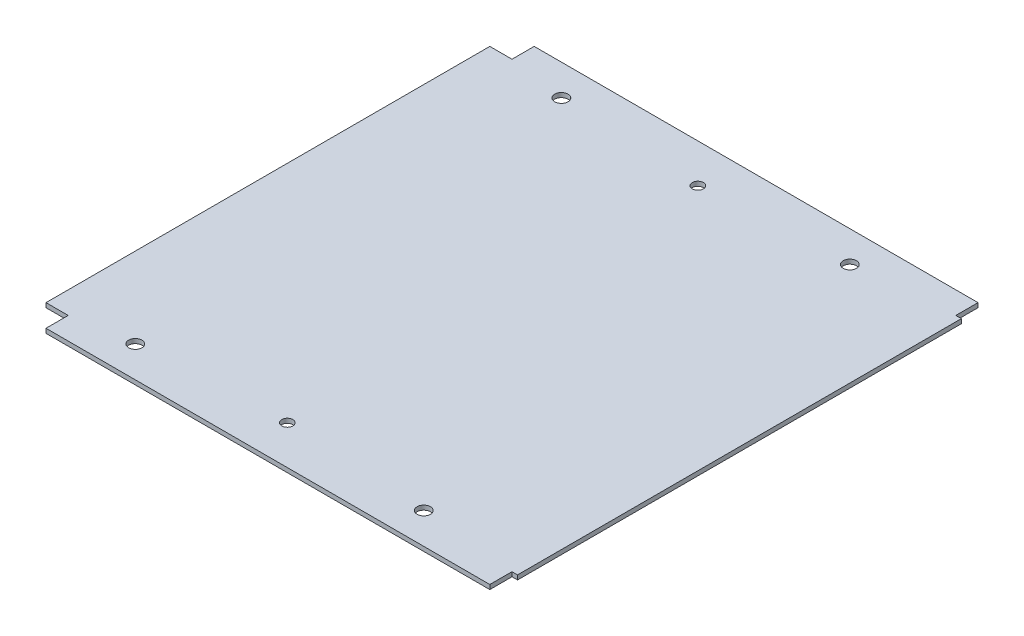
ISO-10303-21;
HEADER;
FILE_DESCRIPTION(('STEP AP214'),'2;1');
FILE_NAME('part.step','',(''),(''),'','','');
FILE_SCHEMA(('AUTOMOTIVE_DESIGN { 1 0 10303 214 1 1 1 1 }'));
ENDSEC;
DATA;
#1=APPLICATION_CONTEXT('core data for automotive mechanical design processes');
#2=APPLICATION_PROTOCOL_DEFINITION('international standard','automotive_design',2000,#1);
#3=PRODUCT_CONTEXT('',#1,'mechanical');
#4=PRODUCT('Part','Part','',(#3));
#5=PRODUCT_RELATED_PRODUCT_CATEGORY('part','',(#4));
#6=PRODUCT_DEFINITION_FORMATION('','',#4);
#7=PRODUCT_DEFINITION_CONTEXT('part definition',#1,'design');
#8=PRODUCT_DEFINITION('design','',#6,#7);
#9=PRODUCT_DEFINITION_SHAPE('','',#8);
#10=(LENGTH_UNIT() NAMED_UNIT(*) SI_UNIT(.MILLI.,.METRE.));
#11=(NAMED_UNIT(*) PLANE_ANGLE_UNIT() SI_UNIT($,.RADIAN.));
#12=(NAMED_UNIT(*) SI_UNIT($,.STERADIAN.) SOLID_ANGLE_UNIT());
#13=UNCERTAINTY_MEASURE_WITH_UNIT(LENGTH_MEASURE(1.E-05),#10,'distance_accuracy_value','');
#14=(GEOMETRIC_REPRESENTATION_CONTEXT(3) GLOBAL_UNCERTAINTY_ASSIGNED_CONTEXT((#13)) GLOBAL_UNIT_ASSIGNED_CONTEXT((#10,
#11,#12)) REPRESENTATION_CONTEXT('',''));
#15=CARTESIAN_POINT('',(0.,0.,0.));
#16=DIRECTION('',(0.,0.,1.));
#17=DIRECTION('',(1.,0.,0.));
#18=AXIS2_PLACEMENT_3D('',#15,#16,#17);
#19=CARTESIAN_POINT('',(-220.,4.,220.));
#20=DIRECTION('',(1.,0.,0.));
#21=DIRECTION('',(0.,0.,-1.));
#22=AXIS2_PLACEMENT_3D('',#19,#20,#21);
#23=PLANE('',#22);
#24=DIRECTION('',(0.,0.,1.));
#25=VECTOR('',#24,1.);
#26=CARTESIAN_POINT('',(-220.,4.,220.));
#27=LINE('',#26,#25);
#28=CARTESIAN_POINT('',(-220.,4.,-200.));
#29=VERTEX_POINT('',#28);
#30=CARTESIAN_POINT('',(-220.,4.,200.));
#31=VERTEX_POINT('',#30);
#32=EDGE_CURVE('E222',#29,#31,#27,.T.);
#33=ORIENTED_EDGE('',*,*,#32,.F.);
#34=DIRECTION('',(0.,1.,0.));
#35=VECTOR('',#34,1.);
#36=CARTESIAN_POINT('',(-220.,-6.,-200.));
#37=LINE('',#36,#35);
#38=CARTESIAN_POINT('',(-220.,0.,-200.));
#39=VERTEX_POINT('',#38);
#40=EDGE_CURVE('E199',#39,#29,#37,.T.);
#41=ORIENTED_EDGE('',*,*,#40,.F.);
#42=DIRECTION('',(0.,0.,1.));
#43=VECTOR('',#42,1.);
#44=CARTESIAN_POINT('',(-220.,0.,220.));
#45=LINE('',#44,#43);
#46=CARTESIAN_POINT('',(-220.,0.,200.));
#47=VERTEX_POINT('',#46);
#48=EDGE_CURVE('E218',#39,#47,#45,.T.);
#49=ORIENTED_EDGE('',*,*,#48,.T.);
#50=DIRECTION('',(0.,1.,0.));
#51=VECTOR('',#50,1.);
#52=CARTESIAN_POINT('',(-220.,-6.,200.));
#53=LINE('',#52,#51);
#54=EDGE_CURVE('E215',#47,#31,#53,.T.);
#55=ORIENTED_EDGE('',*,*,#54,.T.);
#56=EDGE_LOOP('',(#33,#41,#49,#55));
#57=FACE_BOUND('',#56,.T.);
#58=ADVANCED_FACE('F47',(#57),#23,.F.);
#59=CARTESIAN_POINT('',(220.,4.,220.));
#60=DIRECTION('',(0.,0.,-1.));
#61=DIRECTION('',(-1.,0.,0.));
#62=AXIS2_PLACEMENT_3D('',#59,#60,#61);
#63=PLANE('',#62);
#64=DIRECTION('',(1.,0.,0.));
#65=VECTOR('',#64,1.);
#66=CARTESIAN_POINT('',(220.,0.,220.));
#67=LINE('',#66,#65);
#68=CARTESIAN_POINT('',(-200.,0.,220.));
#69=VERTEX_POINT('',#68);
#70=CARTESIAN_POINT('',(200.,0.,220.));
#71=VERTEX_POINT('',#70);
#72=EDGE_CURVE('E233',#69,#71,#67,.T.);
#73=ORIENTED_EDGE('',*,*,#72,.T.);
#74=DIRECTION('',(0.,1.,0.));
#75=VECTOR('',#74,1.);
#76=CARTESIAN_POINT('',(200.,-6.,220.));
#77=LINE('',#76,#75);
#78=CARTESIAN_POINT('',(200.,4.,220.));
#79=VERTEX_POINT('',#78);
#80=EDGE_CURVE('E248',#71,#79,#77,.T.);
#81=ORIENTED_EDGE('',*,*,#80,.T.);
#82=DIRECTION('',(1.,0.,0.));
#83=VECTOR('',#82,1.);
#84=CARTESIAN_POINT('',(220.,4.,220.));
#85=LINE('',#84,#83);
#86=CARTESIAN_POINT('',(-200.,4.,220.));
#87=VERTEX_POINT('',#86);
#88=EDGE_CURVE('E225',#87,#79,#85,.T.);
#89=ORIENTED_EDGE('',*,*,#88,.F.);
#90=DIRECTION('',(0.,1.,0.));
#91=VECTOR('',#90,1.);
#92=CARTESIAN_POINT('',(-200.,-6.,220.));
#93=LINE('',#92,#91);
#94=EDGE_CURVE('E214',#69,#87,#93,.T.);
#95=ORIENTED_EDGE('',*,*,#94,.F.);
#96=EDGE_LOOP('',(#73,#81,#89,#95));
#97=FACE_BOUND('',#96,.T.);
#98=ADVANCED_FACE('F246',(#97),#63,.F.);
#99=CARTESIAN_POINT('',(220.,4.,-220.));
#100=DIRECTION('',(0.,0.,1.));
#101=DIRECTION('',(1.,0.,0.));
#102=AXIS2_PLACEMENT_3D('',#99,#100,#101);
#103=PLANE('',#102);
#104=DIRECTION('',(-1.,0.,0.));
#105=VECTOR('',#104,1.);
#106=CARTESIAN_POINT('',(220.,0.,-220.));
#107=LINE('',#106,#105);
#108=CARTESIAN_POINT('',(200.,0.,-220.));
#109=VERTEX_POINT('',#108);
#110=CARTESIAN_POINT('',(-200.,0.,-220.));
#111=VERTEX_POINT('',#110);
#112=EDGE_CURVE('E226',#109,#111,#107,.T.);
#113=ORIENTED_EDGE('',*,*,#112,.T.);
#114=DIRECTION('',(0.,1.,0.));
#115=VECTOR('',#114,1.);
#116=CARTESIAN_POINT('',(-200.,-6.,-220.));
#117=LINE('',#116,#115);
#118=CARTESIAN_POINT('',(-200.,4.,-220.));
#119=VERTEX_POINT('',#118);
#120=EDGE_CURVE('E190',#111,#119,#117,.T.);
#121=ORIENTED_EDGE('',*,*,#120,.T.);
#122=DIRECTION('',(-1.,0.,0.));
#123=VECTOR('',#122,1.);
#124=CARTESIAN_POINT('',(220.,4.,-220.));
#125=LINE('',#124,#123);
#126=CARTESIAN_POINT('',(200.,4.,-220.));
#127=VERTEX_POINT('',#126);
#128=EDGE_CURVE('E229',#127,#119,#125,.T.);
#129=ORIENTED_EDGE('',*,*,#128,.F.);
#130=DIRECTION('',(0.,1.,0.));
#131=VECTOR('',#130,1.);
#132=CARTESIAN_POINT('',(200.,-6.,-220.));
#133=LINE('',#132,#131);
#134=EDGE_CURVE('E457',#109,#127,#133,.T.);
#135=ORIENTED_EDGE('',*,*,#134,.F.);
#136=EDGE_LOOP('',(#113,#121,#129,#135));
#137=FACE_BOUND('',#136,.T.);
#138=ADVANCED_FACE('F284',(#137),#103,.F.);
#139=CARTESIAN_POINT('',(0.,4.,0.));
#140=DIRECTION('',(0.,1.,0.));
#141=DIRECTION('',(0.,0.,1.));
#142=AXIS2_PLACEMENT_3D('',#139,#140,#141);
#143=PLANE('',#142);
#144=DIRECTION('',(0.,0.,1.));
#145=VECTOR('',#144,1.);
#146=CARTESIAN_POINT('',(205.,4.,-200.));
#147=LINE('',#146,#145);
#148=CARTESIAN_POINT('',(205.,4.,-200.));
#149=VERTEX_POINT('',#148);
#150=CARTESIAN_POINT('',(205.,4.,200.));
#151=VERTEX_POINT('',#150);
#152=EDGE_CURVE('E138',#149,#151,#147,.T.);
#153=ORIENTED_EDGE('',*,*,#152,.F.);
#154=DIRECTION('',(1.,0.,0.));
#155=VECTOR('',#154,1.);
#156=CARTESIAN_POINT('',(220.,4.,-200.));
#157=LINE('',#156,#155);
#158=CARTESIAN_POINT('',(200.,4.,-200.));
#159=VERTEX_POINT('',#158);
#160=EDGE_CURVE('E454',#159,#149,#157,.T.);
#161=ORIENTED_EDGE('',*,*,#160,.F.);
#162=DIRECTION('',(0.,0.,1.));
#163=VECTOR('',#162,1.);
#164=CARTESIAN_POINT('',(200.,4.,-220.));
#165=LINE('',#164,#163);
#166=EDGE_CURVE('E456',#127,#159,#165,.T.);
#167=ORIENTED_EDGE('',*,*,#166,.F.);
#168=ORIENTED_EDGE('',*,*,#128,.T.);
#169=DIRECTION('',(0.,0.,-1.));
#170=VECTOR('',#169,1.);
#171=CARTESIAN_POINT('',(-200.,4.,-220.));
#172=LINE('',#171,#170);
#173=CARTESIAN_POINT('',(-200.,4.,-200.));
#174=VERTEX_POINT('',#173);
#175=EDGE_CURVE('E203',#174,#119,#172,.T.);
#176=ORIENTED_EDGE('',*,*,#175,.F.);
#177=DIRECTION('',(1.,0.,0.));
#178=VECTOR('',#177,1.);
#179=CARTESIAN_POINT('',(-220.,4.,-200.));
#180=LINE('',#179,#178);
#181=EDGE_CURVE('E205',#29,#174,#180,.T.);
#182=ORIENTED_EDGE('',*,*,#181,.F.);
#183=ORIENTED_EDGE('',*,*,#32,.T.);
#184=DIRECTION('',(-1.,0.,0.));
#185=VECTOR('',#184,1.);
#186=CARTESIAN_POINT('',(-220.,4.,200.));
#187=LINE('',#186,#185);
#188=CARTESIAN_POINT('',(-200.,4.,200.));
#189=VERTEX_POINT('',#188);
#190=EDGE_CURVE('E211',#189,#31,#187,.T.);
#191=ORIENTED_EDGE('',*,*,#190,.F.);
#192=DIRECTION('',(0.,0.,-1.));
#193=VECTOR('',#192,1.);
#194=CARTESIAN_POINT('',(-200.,4.,220.));
#195=LINE('',#194,#193);
#196=EDGE_CURVE('E208',#87,#189,#195,.T.);
#197=ORIENTED_EDGE('',*,*,#196,.F.);
#198=ORIENTED_EDGE('',*,*,#88,.T.);
#199=DIRECTION('',(0.,0.,1.));
#200=VECTOR('',#199,1.);
#201=CARTESIAN_POINT('',(200.,4.,220.));
#202=LINE('',#201,#200);
#203=CARTESIAN_POINT('',(200.,4.,200.));
#204=VERTEX_POINT('',#203);
#205=EDGE_CURVE('E253',#204,#79,#202,.T.);
#206=ORIENTED_EDGE('',*,*,#205,.F.);
#207=DIRECTION('',(-1.,0.,0.));
#208=VECTOR('',#207,1.);
#209=CARTESIAN_POINT('',(220.,4.,200.));
#210=LINE('',#209,#208);
#211=EDGE_CURVE('E212',#151,#204,#210,.T.);
#212=ORIENTED_EDGE('',*,*,#211,.F.);
#213=EDGE_LOOP('',(#153,#161,#167,#168,#176,#182,#183,#191,#197,#198,#206,#212));
#214=FACE_BOUND('',#213,.T.);
#215=CARTESIAN_POINT('',(-147.5,4.,192.));
#216=DIRECTION('',(0.,1.,0.));
#217=DIRECTION('',(0.,0.,1.));
#218=AXIS2_PLACEMENT_3D('',#215,#216,#217);
#219=CIRCLE('',#218,6.00000000000002);
#220=CARTESIAN_POINT('',(-147.5,4.,198.));
#221=VERTEX_POINT('',#220);
#222=EDGE_CURVE('E142',#221,#221,#219,.T.);
#223=ORIENTED_EDGE('',*,*,#222,.F.);
#224=EDGE_LOOP('',(#223));
#225=FACE_BOUND('',#224,.T.);
#226=CARTESIAN_POINT('',(-17.5,4.,185.));
#227=DIRECTION('',(0.,1.,0.));
#228=DIRECTION('',(0.,0.,1.));
#229=AXIS2_PLACEMENT_3D('',#226,#227,#228);
#230=CIRCLE('',#229,5.);
#231=CARTESIAN_POINT('',(-17.5,4.,190.));
#232=VERTEX_POINT('',#231);
#233=EDGE_CURVE('E472',#232,#232,#230,.T.);
#234=ORIENTED_EDGE('',*,*,#233,.F.);
#235=EDGE_LOOP('',(#234));
#236=FACE_BOUND('',#235,.T.);
#237=CARTESIAN_POINT('',(112.5,4.,192.));
#238=DIRECTION('',(0.,1.,0.));
#239=DIRECTION('',(0.,0.,1.));
#240=AXIS2_PLACEMENT_3D('',#237,#238,#239);
#241=CIRCLE('',#240,6.00000000000002);
#242=CARTESIAN_POINT('',(112.5,4.,198.));
#243=VERTEX_POINT('',#242);
#244=EDGE_CURVE('E475',#243,#243,#241,.T.);
#245=ORIENTED_EDGE('',*,*,#244,.F.);
#246=EDGE_LOOP('',(#245));
#247=FACE_BOUND('',#246,.T.);
#248=CARTESIAN_POINT('',(-17.5000000000001,4.,-185.));
#249=DIRECTION('',(0.,1.,0.));
#250=DIRECTION('',(0.,0.,1.));
#251=AXIS2_PLACEMENT_3D('',#248,#249,#250);
#252=CIRCLE('',#251,5.00000000000001);
#253=CARTESIAN_POINT('',(-17.5000000000001,4.,-180.));
#254=VERTEX_POINT('',#253);
#255=EDGE_CURVE('E478',#254,#254,#252,.T.);
#256=ORIENTED_EDGE('',*,*,#255,.F.);
#257=EDGE_LOOP('',(#256));
#258=FACE_BOUND('',#257,.T.);
#259=CARTESIAN_POINT('',(112.5,4.,-192.));
#260=DIRECTION('',(0.,1.,0.));
#261=DIRECTION('',(0.,0.,1.));
#262=AXIS2_PLACEMENT_3D('',#259,#260,#261);
#263=CIRCLE('',#262,6.00000000000002);
#264=CARTESIAN_POINT('',(112.5,4.,-186.));
#265=VERTEX_POINT('',#264);
#266=EDGE_CURVE('E469',#265,#265,#263,.T.);
#267=ORIENTED_EDGE('',*,*,#266,.F.);
#268=EDGE_LOOP('',(#267));
#269=FACE_BOUND('',#268,.T.);
#270=CARTESIAN_POINT('',(-147.5,4.,-192.));
#271=DIRECTION('',(0.,1.,0.));
#272=DIRECTION('',(0.,0.,1.));
#273=AXIS2_PLACEMENT_3D('',#270,#271,#272);
#274=CIRCLE('',#273,6.00000000000002);
#275=CARTESIAN_POINT('',(-147.5,4.,-186.));
#276=VERTEX_POINT('',#275);
#277=EDGE_CURVE('E177',#276,#276,#274,.T.);
#278=ORIENTED_EDGE('',*,*,#277,.F.);
#279=EDGE_LOOP('',(#278));
#280=FACE_BOUND('',#279,.T.);
#281=ADVANCED_FACE('F251',(#214,#225,#236,#247,#258,#269,#280),#143,.T.);
#282=CARTESIAN_POINT('',(0.,0.,0.));
#283=DIRECTION('',(0.,1.,0.));
#284=DIRECTION('',(0.,0.,1.));
#285=AXIS2_PLACEMENT_3D('',#282,#283,#284);
#286=PLANE('',#285);
#287=CARTESIAN_POINT('',(-147.5,0.,192.));
#288=DIRECTION('',(0.,1.,0.));
#289=DIRECTION('',(0.,0.,1.));
#290=AXIS2_PLACEMENT_3D('',#287,#288,#289);
#291=CIRCLE('',#290,6.00000000000002);
#292=CARTESIAN_POINT('',(-147.5,0.,198.));
#293=VERTEX_POINT('',#292);
#294=EDGE_CURVE('E50',#293,#293,#291,.T.);
#295=ORIENTED_EDGE('',*,*,#294,.T.);
#296=EDGE_LOOP('',(#295));
#297=FACE_BOUND('',#296,.T.);
#298=CARTESIAN_POINT('',(-17.5,0.,185.));
#299=DIRECTION('',(0.,1.,0.));
#300=DIRECTION('',(0.,0.,1.));
#301=AXIS2_PLACEMENT_3D('',#298,#299,#300);
#302=CIRCLE('',#301,5.);
#303=CARTESIAN_POINT('',(-17.5,0.,190.));
#304=VERTEX_POINT('',#303);
#305=EDGE_CURVE('E185',#304,#304,#302,.T.);
#306=ORIENTED_EDGE('',*,*,#305,.T.);
#307=EDGE_LOOP('',(#306));
#308=FACE_BOUND('',#307,.T.);
#309=CARTESIAN_POINT('',(112.5,0.,192.));
#310=DIRECTION('',(0.,1.,0.));
#311=DIRECTION('',(0.,0.,1.));
#312=AXIS2_PLACEMENT_3D('',#309,#310,#311);
#313=CIRCLE('',#312,6.00000000000002);
#314=CARTESIAN_POINT('',(112.5,0.,198.));
#315=VERTEX_POINT('',#314);
#316=EDGE_CURVE('E183',#315,#315,#313,.T.);
#317=ORIENTED_EDGE('',*,*,#316,.T.);
#318=EDGE_LOOP('',(#317));
#319=FACE_BOUND('',#318,.T.);
#320=CARTESIAN_POINT('',(-17.5000000000001,0.,-185.));
#321=DIRECTION('',(0.,1.,0.));
#322=DIRECTION('',(0.,0.,1.));
#323=AXIS2_PLACEMENT_3D('',#320,#321,#322);
#324=CIRCLE('',#323,5.00000000000001);
#325=CARTESIAN_POINT('',(-17.5000000000001,0.,-180.));
#326=VERTEX_POINT('',#325);
#327=EDGE_CURVE('E180',#326,#326,#324,.T.);
#328=ORIENTED_EDGE('',*,*,#327,.T.);
#329=EDGE_LOOP('',(#328));
#330=FACE_BOUND('',#329,.T.);
#331=CARTESIAN_POINT('',(112.5,0.,-192.));
#332=DIRECTION('',(0.,1.,0.));
#333=DIRECTION('',(0.,0.,1.));
#334=AXIS2_PLACEMENT_3D('',#331,#332,#333);
#335=CIRCLE('',#334,6.00000000000002);
#336=CARTESIAN_POINT('',(112.5,0.,-186.));
#337=VERTEX_POINT('',#336);
#338=EDGE_CURVE('E176',#337,#337,#335,.T.);
#339=ORIENTED_EDGE('',*,*,#338,.T.);
#340=EDGE_LOOP('',(#339));
#341=FACE_BOUND('',#340,.T.);
#342=CARTESIAN_POINT('',(-147.5,0.,-192.));
#343=DIRECTION('',(0.,1.,0.));
#344=DIRECTION('',(0.,0.,1.));
#345=AXIS2_PLACEMENT_3D('',#342,#343,#344);
#346=CIRCLE('',#345,6.00000000000002);
#347=CARTESIAN_POINT('',(-147.5,0.,-186.));
#348=VERTEX_POINT('',#347);
#349=EDGE_CURVE('E173',#348,#348,#346,.T.);
#350=ORIENTED_EDGE('',*,*,#349,.T.);
#351=EDGE_LOOP('',(#350));
#352=FACE_BOUND('',#351,.T.);
#353=DIRECTION('',(1.,0.,0.));
#354=VECTOR('',#353,1.);
#355=CARTESIAN_POINT('',(0.,0.,-200.));
#356=LINE('',#355,#354);
#357=CARTESIAN_POINT('',(200.,0.,-200.));
#358=VERTEX_POINT('',#357);
#359=CARTESIAN_POINT('',(205.,0.,-200.));
#360=VERTEX_POINT('',#359);
#361=EDGE_CURVE('E153',#358,#360,#356,.T.);
#362=ORIENTED_EDGE('',*,*,#361,.T.);
#363=DIRECTION('',(0.,0.,1.));
#364=VECTOR('',#363,1.);
#365=CARTESIAN_POINT('',(205.,0.,-200.));
#366=LINE('',#365,#364);
#367=CARTESIAN_POINT('',(205.,0.,200.));
#368=VERTEX_POINT('',#367);
#369=EDGE_CURVE('E63',#360,#368,#366,.T.);
#370=ORIENTED_EDGE('',*,*,#369,.T.);
#371=DIRECTION('',(-1.,0.,0.));
#372=VECTOR('',#371,1.);
#373=CARTESIAN_POINT('',(0.,0.,200.));
#374=LINE('',#373,#372);
#375=CARTESIAN_POINT('',(200.,0.,200.));
#376=VERTEX_POINT('',#375);
#377=EDGE_CURVE('E149',#368,#376,#374,.T.);
#378=ORIENTED_EDGE('',*,*,#377,.T.);
#379=DIRECTION('',(0.,0.,1.));
#380=VECTOR('',#379,1.);
#381=CARTESIAN_POINT('',(200.,0.,0.));
#382=LINE('',#381,#380);
#383=EDGE_CURVE('E159',#376,#71,#382,.T.);
#384=ORIENTED_EDGE('',*,*,#383,.T.);
#385=ORIENTED_EDGE('',*,*,#72,.F.);
#386=DIRECTION('',(0.,0.,-1.));
#387=VECTOR('',#386,1.);
#388=CARTESIAN_POINT('',(-200.,0.,0.));
#389=LINE('',#388,#387);
#390=CARTESIAN_POINT('',(-200.,0.,200.));
#391=VERTEX_POINT('',#390);
#392=EDGE_CURVE('E165',#69,#391,#389,.T.);
#393=ORIENTED_EDGE('',*,*,#392,.T.);
#394=DIRECTION('',(-1.,0.,0.));
#395=VECTOR('',#394,1.);
#396=CARTESIAN_POINT('',(-2.7755575615629E-13,0.,200.));
#397=LINE('',#396,#395);
#398=EDGE_CURVE('E160',#391,#47,#397,.T.);
#399=ORIENTED_EDGE('',*,*,#398,.T.);
#400=ORIENTED_EDGE('',*,*,#48,.F.);
#401=DIRECTION('',(1.,0.,0.));
#402=VECTOR('',#401,1.);
#403=CARTESIAN_POINT('',(0.,0.,-200.));
#404=LINE('',#403,#402);
#405=CARTESIAN_POINT('',(-200.,0.,-200.));
#406=VERTEX_POINT('',#405);
#407=EDGE_CURVE('E55',#39,#406,#404,.T.);
#408=ORIENTED_EDGE('',*,*,#407,.T.);
#409=DIRECTION('',(0.,0.,-1.));
#410=VECTOR('',#409,1.);
#411=CARTESIAN_POINT('',(-200.,0.,0.));
#412=LINE('',#411,#410);
#413=EDGE_CURVE('E11',#406,#111,#412,.T.);
#414=ORIENTED_EDGE('',*,*,#413,.T.);
#415=ORIENTED_EDGE('',*,*,#112,.F.);
#416=DIRECTION('',(0.,0.,1.));
#417=VECTOR('',#416,1.);
#418=CARTESIAN_POINT('',(200.,0.,0.));
#419=LINE('',#418,#417);
#420=EDGE_CURVE('E162',#109,#358,#419,.T.);
#421=ORIENTED_EDGE('',*,*,#420,.T.);
#422=EDGE_LOOP('',(#362,#370,#378,#384,#385,#393,#399,#400,#408,#414,#415,#421));
#423=FACE_BOUND('',#422,.T.);
#424=ADVANCED_FACE('F147',(#297,#308,#319,#330,#341,#352,#423),#286,.F.);
#425=CARTESIAN_POINT('',(-220.,-6.,200.));
#426=DIRECTION('',(0.,0.,-1.));
#427=DIRECTION('',(-1.,0.,0.));
#428=AXIS2_PLACEMENT_3D('',#425,#426,#427);
#429=PLANE('',#428);
#430=DIRECTION('',(0.,1.,0.));
#431=VECTOR('',#430,1.);
#432=CARTESIAN_POINT('',(-200.,-6.,200.));
#433=LINE('',#432,#431);
#434=EDGE_CURVE('E219',#391,#189,#433,.T.);
#435=ORIENTED_EDGE('',*,*,#434,.T.);
#436=ORIENTED_EDGE('',*,*,#190,.T.);
#437=ORIENTED_EDGE('',*,*,#54,.F.);
#438=ORIENTED_EDGE('',*,*,#398,.F.);
#439=EDGE_LOOP('',(#435,#436,#437,#438));
#440=FACE_BOUND('',#439,.T.);
#441=ADVANCED_FACE('F258',(#440),#429,.F.);
#442=CARTESIAN_POINT('',(-200.,-6.,220.));
#443=DIRECTION('',(1.,0.,0.));
#444=DIRECTION('',(0.,0.,-1.));
#445=AXIS2_PLACEMENT_3D('',#442,#443,#444);
#446=PLANE('',#445);
#447=ORIENTED_EDGE('',*,*,#94,.T.);
#448=ORIENTED_EDGE('',*,*,#196,.T.);
#449=ORIENTED_EDGE('',*,*,#434,.F.);
#450=ORIENTED_EDGE('',*,*,#392,.F.);
#451=EDGE_LOOP('',(#447,#448,#449,#450));
#452=FACE_BOUND('',#451,.T.);
#453=ADVANCED_FACE('F242',(#452),#446,.F.);
#454=CARTESIAN_POINT('',(200.,-6.,220.));
#455=DIRECTION('',(-1.,0.,0.));
#456=DIRECTION('',(0.,0.,1.));
#457=AXIS2_PLACEMENT_3D('',#454,#455,#456);
#458=PLANE('',#457);
#459=DIRECTION('',(0.,1.,0.));
#460=VECTOR('',#459,1.);
#461=CARTESIAN_POINT('',(200.,-6.,200.));
#462=LINE('',#461,#460);
#463=EDGE_CURVE('E157',#376,#204,#462,.T.);
#464=ORIENTED_EDGE('',*,*,#463,.T.);
#465=ORIENTED_EDGE('',*,*,#205,.T.);
#466=ORIENTED_EDGE('',*,*,#80,.F.);
#467=ORIENTED_EDGE('',*,*,#383,.F.);
#468=EDGE_LOOP('',(#464,#465,#466,#467));
#469=FACE_BOUND('',#468,.T.);
#470=ADVANCED_FACE('F295',(#469),#458,.F.);
#471=CARTESIAN_POINT('',(220.,-6.,200.));
#472=DIRECTION('',(0.,0.,-1.));
#473=DIRECTION('',(-1.,0.,0.));
#474=AXIS2_PLACEMENT_3D('',#471,#472,#473);
#475=PLANE('',#474);
#476=ORIENTED_EDGE('',*,*,#377,.F.);
#477=DIRECTION('',(0.,1.,0.));
#478=VECTOR('',#477,1.);
#479=CARTESIAN_POINT('',(205.,0.,200.));
#480=LINE('',#479,#478);
#481=EDGE_CURVE('E135',#368,#151,#480,.T.);
#482=ORIENTED_EDGE('',*,*,#481,.T.);
#483=ORIENTED_EDGE('',*,*,#211,.T.);
#484=ORIENTED_EDGE('',*,*,#463,.F.);
#485=EDGE_LOOP('',(#476,#482,#483,#484));
#486=FACE_BOUND('',#485,.T.);
#487=ADVANCED_FACE('F155',(#486),#475,.F.);
#488=CARTESIAN_POINT('',(220.,-6.,-200.));
#489=DIRECTION('',(0.,0.,1.));
#490=DIRECTION('',(1.,0.,0.));
#491=AXIS2_PLACEMENT_3D('',#488,#489,#490);
#492=PLANE('',#491);
#493=ORIENTED_EDGE('',*,*,#160,.T.);
#494=DIRECTION('',(0.,1.,0.));
#495=VECTOR('',#494,1.);
#496=CARTESIAN_POINT('',(205.,0.,-200.));
#497=LINE('',#496,#495);
#498=EDGE_CURVE('E143',#360,#149,#497,.T.);
#499=ORIENTED_EDGE('',*,*,#498,.F.);
#500=ORIENTED_EDGE('',*,*,#361,.F.);
#501=DIRECTION('',(0.,1.,0.));
#502=VECTOR('',#501,1.);
#503=CARTESIAN_POINT('',(200.,-6.,-200.));
#504=LINE('',#503,#502);
#505=EDGE_CURVE('E207',#358,#159,#504,.T.);
#506=ORIENTED_EDGE('',*,*,#505,.T.);
#507=EDGE_LOOP('',(#493,#499,#500,#506));
#508=FACE_BOUND('',#507,.T.);
#509=ADVANCED_FACE('F276',(#508),#492,.F.);
#510=CARTESIAN_POINT('',(200.,-6.,-220.));
#511=DIRECTION('',(-1.,0.,0.));
#512=DIRECTION('',(0.,0.,1.));
#513=AXIS2_PLACEMENT_3D('',#510,#511,#512);
#514=PLANE('',#513);
#515=ORIENTED_EDGE('',*,*,#134,.T.);
#516=ORIENTED_EDGE('',*,*,#166,.T.);
#517=ORIENTED_EDGE('',*,*,#505,.F.);
#518=ORIENTED_EDGE('',*,*,#420,.F.);
#519=EDGE_LOOP('',(#515,#516,#517,#518));
#520=FACE_BOUND('',#519,.T.);
#521=ADVANCED_FACE('F268',(#520),#514,.F.);
#522=CARTESIAN_POINT('',(-200.,-6.,-220.));
#523=DIRECTION('',(1.,0.,0.));
#524=DIRECTION('',(0.,0.,-1.));
#525=AXIS2_PLACEMENT_3D('',#522,#523,#524);
#526=PLANE('',#525);
#527=DIRECTION('',(0.,1.,0.));
#528=VECTOR('',#527,1.);
#529=CARTESIAN_POINT('',(-200.,-6.,-200.));
#530=LINE('',#529,#528);
#531=EDGE_CURVE('E71',#406,#174,#530,.T.);
#532=ORIENTED_EDGE('',*,*,#531,.T.);
#533=ORIENTED_EDGE('',*,*,#175,.T.);
#534=ORIENTED_EDGE('',*,*,#120,.F.);
#535=ORIENTED_EDGE('',*,*,#413,.F.);
#536=EDGE_LOOP('',(#532,#533,#534,#535));
#537=FACE_BOUND('',#536,.T.);
#538=ADVANCED_FACE('F266',(#537),#526,.F.);
#539=CARTESIAN_POINT('',(-220.,-6.,-200.));
#540=DIRECTION('',(0.,0.,1.));
#541=DIRECTION('',(1.,0.,0.));
#542=AXIS2_PLACEMENT_3D('',#539,#540,#541);
#543=PLANE('',#542);
#544=ORIENTED_EDGE('',*,*,#40,.T.);
#545=ORIENTED_EDGE('',*,*,#181,.T.);
#546=ORIENTED_EDGE('',*,*,#531,.F.);
#547=ORIENTED_EDGE('',*,*,#407,.F.);
#548=EDGE_LOOP('',(#544,#545,#546,#547));
#549=FACE_BOUND('',#548,.T.);
#550=ADVANCED_FACE('F262',(#549),#543,.F.);
#551=CARTESIAN_POINT('',(-147.5,-6.,-192.));
#552=DIRECTION('',(0.,1.,0.));
#553=DIRECTION('',(0.,0.,1.));
#554=AXIS2_PLACEMENT_3D('',#551,#552,#553);
#555=CYLINDRICAL_SURFACE('',#554,6.00000000000002);
#556=ORIENTED_EDGE('',*,*,#277,.T.);
#557=EDGE_LOOP('',(#556));
#558=FACE_BOUND('',#557,.T.);
#559=ORIENTED_EDGE('',*,*,#349,.F.);
#560=EDGE_LOOP('',(#559));
#561=FACE_BOUND('',#560,.T.);
#562=ADVANCED_FACE('F274',(#558,#561),#555,.F.);
#563=CARTESIAN_POINT('',(112.5,-6.,-192.));
#564=DIRECTION('',(0.,1.,0.));
#565=DIRECTION('',(0.,0.,1.));
#566=AXIS2_PLACEMENT_3D('',#563,#564,#565);
#567=CYLINDRICAL_SURFACE('',#566,6.00000000000002);
#568=ORIENTED_EDGE('',*,*,#266,.T.);
#569=EDGE_LOOP('',(#568));
#570=FACE_BOUND('',#569,.T.);
#571=ORIENTED_EDGE('',*,*,#338,.F.);
#572=EDGE_LOOP('',(#571));
#573=FACE_BOUND('',#572,.T.);
#574=ADVANCED_FACE('F346',(#570,#573),#567,.F.);
#575=CARTESIAN_POINT('',(-17.5000000000001,-6.,-185.));
#576=DIRECTION('',(0.,1.,0.));
#577=DIRECTION('',(0.,0.,1.));
#578=AXIS2_PLACEMENT_3D('',#575,#576,#577);
#579=CYLINDRICAL_SURFACE('',#578,5.00000000000001);
#580=ORIENTED_EDGE('',*,*,#255,.T.);
#581=EDGE_LOOP('',(#580));
#582=FACE_BOUND('',#581,.T.);
#583=ORIENTED_EDGE('',*,*,#327,.F.);
#584=EDGE_LOOP('',(#583));
#585=FACE_BOUND('',#584,.T.);
#586=ADVANCED_FACE('F356',(#582,#585),#579,.F.);
#587=CARTESIAN_POINT('',(112.5,-6.,192.));
#588=DIRECTION('',(0.,1.,0.));
#589=DIRECTION('',(0.,0.,1.));
#590=AXIS2_PLACEMENT_3D('',#587,#588,#589);
#591=CYLINDRICAL_SURFACE('',#590,6.00000000000002);
#592=ORIENTED_EDGE('',*,*,#244,.T.);
#593=EDGE_LOOP('',(#592));
#594=FACE_BOUND('',#593,.T.);
#595=ORIENTED_EDGE('',*,*,#316,.F.);
#596=EDGE_LOOP('',(#595));
#597=FACE_BOUND('',#596,.T.);
#598=ADVANCED_FACE('F366',(#594,#597),#591,.F.);
#599=CARTESIAN_POINT('',(-17.5,-6.,185.));
#600=DIRECTION('',(0.,1.,0.));
#601=DIRECTION('',(0.,0.,1.));
#602=AXIS2_PLACEMENT_3D('',#599,#600,#601);
#603=CYLINDRICAL_SURFACE('',#602,5.);
#604=ORIENTED_EDGE('',*,*,#233,.T.);
#605=EDGE_LOOP('',(#604));
#606=FACE_BOUND('',#605,.T.);
#607=ORIENTED_EDGE('',*,*,#305,.F.);
#608=EDGE_LOOP('',(#607));
#609=FACE_BOUND('',#608,.T.);
#610=ADVANCED_FACE('F376',(#606,#609),#603,.F.);
#611=CARTESIAN_POINT('',(-147.5,-6.,192.));
#612=DIRECTION('',(0.,1.,0.));
#613=DIRECTION('',(0.,0.,1.));
#614=AXIS2_PLACEMENT_3D('',#611,#612,#613);
#615=CYLINDRICAL_SURFACE('',#614,6.00000000000002);
#616=ORIENTED_EDGE('',*,*,#222,.T.);
#617=EDGE_LOOP('',(#616));
#618=FACE_BOUND('',#617,.T.);
#619=ORIENTED_EDGE('',*,*,#294,.F.);
#620=EDGE_LOOP('',(#619));
#621=FACE_BOUND('',#620,.T.);
#622=ADVANCED_FACE('F386',(#618,#621),#615,.F.);
#623=CARTESIAN_POINT('',(205.,0.,-200.));
#624=DIRECTION('',(-1.,0.,0.));
#625=DIRECTION('',(0.,0.,1.));
#626=AXIS2_PLACEMENT_3D('',#623,#624,#625);
#627=PLANE('',#626);
#628=ORIENTED_EDGE('',*,*,#152,.T.);
#629=ORIENTED_EDGE('',*,*,#481,.F.);
#630=ORIENTED_EDGE('',*,*,#369,.F.);
#631=ORIENTED_EDGE('',*,*,#498,.T.);
#632=EDGE_LOOP('',(#628,#629,#630,#631));
#633=FACE_BOUND('',#632,.T.);
#634=ADVANCED_FACE('F136',(#633),#627,.F.);
#635=CLOSED_SHELL('',(#58,#98,#138,#281,#424,#441,#453,#470,#487,#509,#521,#538,#550,#562,#574,
#586,#598,#610,#622,#634));
#636=MANIFOLD_SOLID_BREP('B2',#635);
#637=ADVANCED_BREP_SHAPE_REPRESENTATION('',(#18,#636),#14);
#638=SHAPE_DEFINITION_REPRESENTATION(#9,#637);
ENDSEC;
END-ISO-10303-21;
